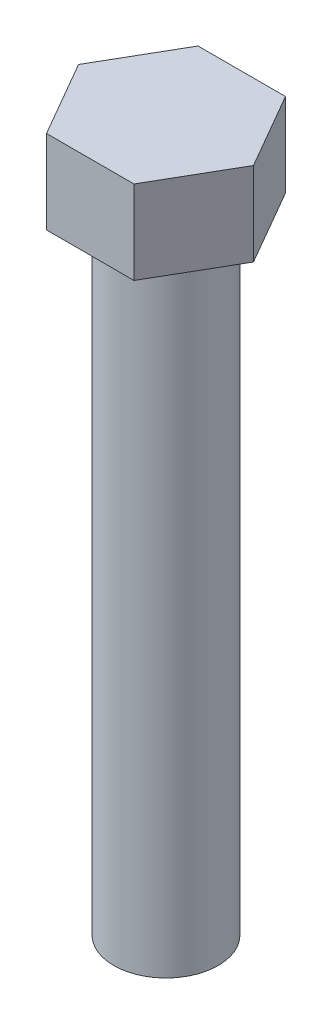
ISO-10303-21;
HEADER;
FILE_DESCRIPTION(('STEP AP214'),'2;1');
FILE_NAME('part.step','',(''),(''),'','','');
FILE_SCHEMA(('AUTOMOTIVE_DESIGN { 1 0 10303 214 1 1 1 1 }'));
ENDSEC;
DATA;
#1=APPLICATION_CONTEXT('core data for automotive mechanical design processes');
#2=APPLICATION_PROTOCOL_DEFINITION('international standard','automotive_design',2000,#1);
#3=PRODUCT_CONTEXT('',#1,'mechanical');
#4=PRODUCT('Part','Part','',(#3));
#5=PRODUCT_RELATED_PRODUCT_CATEGORY('part','',(#4));
#6=PRODUCT_DEFINITION_FORMATION('','',#4);
#7=PRODUCT_DEFINITION_CONTEXT('part definition',#1,'design');
#8=PRODUCT_DEFINITION('design','',#6,#7);
#9=PRODUCT_DEFINITION_SHAPE('','',#8);
#10=(LENGTH_UNIT() NAMED_UNIT(*) SI_UNIT(.MILLI.,.METRE.));
#11=(NAMED_UNIT(*) PLANE_ANGLE_UNIT() SI_UNIT($,.RADIAN.));
#12=(NAMED_UNIT(*) SI_UNIT($,.STERADIAN.) SOLID_ANGLE_UNIT());
#13=UNCERTAINTY_MEASURE_WITH_UNIT(LENGTH_MEASURE(1.E-05),#10,'distance_accuracy_value','');
#14=(GEOMETRIC_REPRESENTATION_CONTEXT(3) GLOBAL_UNCERTAINTY_ASSIGNED_CONTEXT((#13)) GLOBAL_UNIT_ASSIGNED_CONTEXT((#10,
#11,#12)) REPRESENTATION_CONTEXT('',''));
#15=CARTESIAN_POINT('',(0.,0.,0.));
#16=DIRECTION('',(0.,0.,1.));
#17=DIRECTION('',(1.,0.,0.));
#18=AXIS2_PLACEMENT_3D('',#15,#16,#17);
#19=CARTESIAN_POINT('',(0.,-600.,0.));
#20=DIRECTION('',(0.,1.,0.));
#21=DIRECTION('',(0.,0.,1.));
#22=AXIS2_PLACEMENT_3D('',#19,#20,#21);
#23=CYLINDRICAL_SURFACE('',#22,50.);
#24=CARTESIAN_POINT('',(0.,-600.,0.));
#25=DIRECTION('',(0.,1.,0.));
#26=DIRECTION('',(0.,0.,1.));
#27=AXIS2_PLACEMENT_3D('',#24,#25,#26);
#28=CIRCLE('',#27,50.);
#29=CARTESIAN_POINT('',(0.,-600.,50.));
#30=VERTEX_POINT('',#29);
#31=EDGE_CURVE('E11',#30,#30,#28,.T.);
#32=ORIENTED_EDGE('',*,*,#31,.T.);
#33=EDGE_LOOP('',(#32));
#34=FACE_BOUND('',#33,.T.);
#35=CARTESIAN_POINT('',(0.,0.,0.));
#36=DIRECTION('',(0.,1.,0.));
#37=DIRECTION('',(0.,0.,1.));
#38=AXIS2_PLACEMENT_3D('',#35,#36,#37);
#39=CIRCLE('',#38,50.);
#40=CARTESIAN_POINT('',(0.,0.,50.));
#41=VERTEX_POINT('',#40);
#42=EDGE_CURVE('E48',#41,#41,#39,.T.);
#43=ORIENTED_EDGE('',*,*,#42,.F.);
#44=EDGE_LOOP('',(#43));
#45=FACE_BOUND('',#44,.T.);
#46=ADVANCED_FACE('F45',(#34,#45),#23,.T.);
#47=CARTESIAN_POINT('',(0.,-600.,0.));
#48=DIRECTION('',(0.,1.,0.));
#49=DIRECTION('',(0.,0.,1.));
#50=AXIS2_PLACEMENT_3D('',#47,#48,#49);
#51=PLANE('',#50);
#52=ORIENTED_EDGE('',*,*,#31,.F.);
#53=EDGE_LOOP('',(#52));
#54=FACE_BOUND('',#53,.T.);
#55=ADVANCED_FACE('F173',(#54),#51,.F.);
#56=CARTESIAN_POINT('',(-41.8578945162478,80.,72.5));
#57=DIRECTION('',(0.,0.,-1.));
#58=DIRECTION('',(-1.,0.,0.));
#59=AXIS2_PLACEMENT_3D('',#56,#57,#58);
#60=PLANE('',#59);
#61=DIRECTION('',(1.,0.,0.));
#62=VECTOR('',#61,1.);
#63=CARTESIAN_POINT('',(-41.8578945162478,0.,72.5));
#64=LINE('',#63,#62);
#65=CARTESIAN_POINT('',(-41.8578945162478,0.,72.5));
#66=VERTEX_POINT('',#65);
#67=CARTESIAN_POINT('',(41.8578945162479,0.,72.5));
#68=VERTEX_POINT('',#67);
#69=EDGE_CURVE('E135',#66,#68,#64,.T.);
#70=ORIENTED_EDGE('',*,*,#69,.T.);
#71=DIRECTION('',(0.,-1.,0.));
#72=VECTOR('',#71,1.);
#73=CARTESIAN_POINT('',(41.8578945162479,80.,72.5));
#74=LINE('',#73,#72);
#75=CARTESIAN_POINT('',(41.8578945162479,80.,72.5));
#76=VERTEX_POINT('',#75);
#77=EDGE_CURVE('E162',#76,#68,#74,.T.);
#78=ORIENTED_EDGE('',*,*,#77,.F.);
#79=DIRECTION('',(1.,0.,0.));
#80=VECTOR('',#79,1.);
#81=CARTESIAN_POINT('',(-41.8578945162478,80.,72.5));
#82=LINE('',#81,#80);
#83=CARTESIAN_POINT('',(-41.8578945162478,80.,72.5));
#84=VERTEX_POINT('',#83);
#85=EDGE_CURVE('E151',#84,#76,#82,.T.);
#86=ORIENTED_EDGE('',*,*,#85,.F.);
#87=DIRECTION('',(0.,-1.,0.));
#88=VECTOR('',#87,1.);
#89=CARTESIAN_POINT('',(-41.8578945162478,80.,72.5));
#90=LINE('',#89,#88);
#91=EDGE_CURVE('E131',#84,#66,#90,.T.);
#92=ORIENTED_EDGE('',*,*,#91,.T.);
#93=EDGE_LOOP('',(#70,#78,#86,#92));
#94=FACE_BOUND('',#93,.T.);
#95=ADVANCED_FACE('F178',(#94),#60,.F.);
#96=CARTESIAN_POINT('',(41.8578945162479,80.,72.5));
#97=DIRECTION('',(-0.866025403784439,0.,-0.5));
#98=DIRECTION('',(-0.5,0.,0.866025403784439));
#99=AXIS2_PLACEMENT_3D('',#96,#97,#98);
#100=PLANE('',#99);
#101=DIRECTION('',(0.5,0.,-0.866025403784439));
#102=VECTOR('',#101,1.);
#103=CARTESIAN_POINT('',(41.8578945162479,0.,72.5));
#104=LINE('',#103,#102);
#105=CARTESIAN_POINT('',(83.7157890324957,0.,0.));
#106=VERTEX_POINT('',#105);
#107=EDGE_CURVE('E139',#68,#106,#104,.T.);
#108=ORIENTED_EDGE('',*,*,#107,.T.);
#109=DIRECTION('',(0.,-1.,0.));
#110=VECTOR('',#109,1.);
#111=CARTESIAN_POINT('',(83.7157890324957,80.,0.));
#112=LINE('',#111,#110);
#113=CARTESIAN_POINT('',(83.7157890324957,80.,0.));
#114=VERTEX_POINT('',#113);
#115=EDGE_CURVE('E158',#114,#106,#112,.T.);
#116=ORIENTED_EDGE('',*,*,#115,.F.);
#117=DIRECTION('',(0.5,0.,-0.866025403784439));
#118=VECTOR('',#117,1.);
#119=CARTESIAN_POINT('',(41.8578945162479,80.,72.5));
#120=LINE('',#119,#118);
#121=EDGE_CURVE('E100',#76,#114,#120,.T.);
#122=ORIENTED_EDGE('',*,*,#121,.F.);
#123=ORIENTED_EDGE('',*,*,#77,.T.);
#124=EDGE_LOOP('',(#108,#116,#122,#123));
#125=FACE_BOUND('',#124,.T.);
#126=ADVANCED_FACE('F184',(#125),#100,.F.);
#127=CARTESIAN_POINT('',(83.7157890324957,80.,0.));
#128=DIRECTION('',(-0.866025403784438,0.,0.5));
#129=DIRECTION('',(0.5,0.,0.866025403784439));
#130=AXIS2_PLACEMENT_3D('',#127,#128,#129);
#131=PLANE('',#130);
#132=DIRECTION('',(-0.5,0.,-0.866025403784438));
#133=VECTOR('',#132,1.);
#134=CARTESIAN_POINT('',(83.7157890324957,0.,0.));
#135=LINE('',#134,#133);
#136=CARTESIAN_POINT('',(41.8578945162479,0.,-72.5));
#137=VERTEX_POINT('',#136);
#138=EDGE_CURVE('E142',#106,#137,#135,.T.);
#139=ORIENTED_EDGE('',*,*,#138,.T.);
#140=DIRECTION('',(0.,-1.,0.));
#141=VECTOR('',#140,1.);
#142=CARTESIAN_POINT('',(41.8578945162479,80.,-72.5));
#143=LINE('',#142,#141);
#144=CARTESIAN_POINT('',(41.8578945162479,80.,-72.5));
#145=VERTEX_POINT('',#144);
#146=EDGE_CURVE('E124',#145,#137,#143,.T.);
#147=ORIENTED_EDGE('',*,*,#146,.F.);
#148=DIRECTION('',(-0.5,0.,-0.866025403784438));
#149=VECTOR('',#148,1.);
#150=CARTESIAN_POINT('',(83.7157890324957,80.,0.));
#151=LINE('',#150,#149);
#152=EDGE_CURVE('E113',#114,#145,#151,.T.);
#153=ORIENTED_EDGE('',*,*,#152,.F.);
#154=ORIENTED_EDGE('',*,*,#115,.T.);
#155=EDGE_LOOP('',(#139,#147,#153,#154));
#156=FACE_BOUND('',#155,.T.);
#157=ADVANCED_FACE('F190',(#156),#131,.F.);
#158=CARTESIAN_POINT('',(41.8578945162479,80.,-72.5));
#159=DIRECTION('',(0.,0.,1.));
#160=DIRECTION('',(1.,0.,0.));
#161=AXIS2_PLACEMENT_3D('',#158,#159,#160);
#162=PLANE('',#161);
#163=DIRECTION('',(-1.,0.,0.));
#164=VECTOR('',#163,1.);
#165=CARTESIAN_POINT('',(41.8578945162479,0.,-72.5));
#166=LINE('',#165,#164);
#167=CARTESIAN_POINT('',(-41.8578945162478,0.,-72.5));
#168=VERTEX_POINT('',#167);
#169=EDGE_CURVE('E122',#137,#168,#166,.T.);
#170=ORIENTED_EDGE('',*,*,#169,.T.);
#171=DIRECTION('',(0.,-1.,0.));
#172=VECTOR('',#171,1.);
#173=CARTESIAN_POINT('',(-41.8578945162478,80.,-72.5));
#174=LINE('',#173,#172);
#175=CARTESIAN_POINT('',(-41.8578945162478,80.,-72.5));
#176=VERTEX_POINT('',#175);
#177=EDGE_CURVE('E119',#176,#168,#174,.T.);
#178=ORIENTED_EDGE('',*,*,#177,.F.);
#179=DIRECTION('',(-1.,0.,0.));
#180=VECTOR('',#179,1.);
#181=CARTESIAN_POINT('',(41.8578945162479,80.,-72.5));
#182=LINE('',#181,#180);
#183=EDGE_CURVE('E107',#145,#176,#182,.T.);
#184=ORIENTED_EDGE('',*,*,#183,.F.);
#185=ORIENTED_EDGE('',*,*,#146,.T.);
#186=EDGE_LOOP('',(#170,#178,#184,#185));
#187=FACE_BOUND('',#186,.T.);
#188=ADVANCED_FACE('F120',(#187),#162,.F.);
#189=CARTESIAN_POINT('',(-41.8578945162478,80.,-72.5));
#190=DIRECTION('',(0.866025403784439,0.,0.5));
#191=DIRECTION('',(0.5,0.,-0.866025403784439));
#192=AXIS2_PLACEMENT_3D('',#189,#190,#191);
#193=PLANE('',#192);
#194=DIRECTION('',(-0.5,0.,0.866025403784439));
#195=VECTOR('',#194,1.);
#196=CARTESIAN_POINT('',(-41.8578945162478,0.,-72.5));
#197=LINE('',#196,#195);
#198=CARTESIAN_POINT('',(-83.7157890324957,0.,0.));
#199=VERTEX_POINT('',#198);
#200=EDGE_CURVE('E85',#168,#199,#197,.T.);
#201=ORIENTED_EDGE('',*,*,#200,.T.);
#202=DIRECTION('',(0.,-1.,0.));
#203=VECTOR('',#202,1.);
#204=CARTESIAN_POINT('',(-83.7157890324957,80.,0.));
#205=LINE('',#204,#203);
#206=CARTESIAN_POINT('',(-83.7157890324957,80.,0.));
#207=VERTEX_POINT('',#206);
#208=EDGE_CURVE('E125',#207,#199,#205,.T.);
#209=ORIENTED_EDGE('',*,*,#208,.F.);
#210=DIRECTION('',(-0.5,0.,0.866025403784439));
#211=VECTOR('',#210,1.);
#212=CARTESIAN_POINT('',(-41.8578945162478,80.,-72.5));
#213=LINE('',#212,#211);
#214=EDGE_CURVE('E111',#176,#207,#213,.T.);
#215=ORIENTED_EDGE('',*,*,#214,.F.);
#216=ORIENTED_EDGE('',*,*,#177,.T.);
#217=EDGE_LOOP('',(#201,#209,#215,#216));
#218=FACE_BOUND('',#217,.T.);
#219=ADVANCED_FACE('F127',(#218),#193,.F.);
#220=CARTESIAN_POINT('',(-83.7157890324957,80.,0.));
#221=DIRECTION('',(0.866025403784439,0.,-0.5));
#222=DIRECTION('',(-0.5,0.,-0.866025403784439));
#223=AXIS2_PLACEMENT_3D('',#220,#221,#222);
#224=PLANE('',#223);
#225=DIRECTION('',(0.5,0.,0.866025403784439));
#226=VECTOR('',#225,1.);
#227=CARTESIAN_POINT('',(-83.7157890324957,0.,0.));
#228=LINE('',#227,#226);
#229=EDGE_CURVE('E91',#199,#66,#228,.T.);
#230=ORIENTED_EDGE('',*,*,#229,.T.);
#231=ORIENTED_EDGE('',*,*,#91,.F.);
#232=DIRECTION('',(0.5,0.,0.866025403784439));
#233=VECTOR('',#232,1.);
#234=CARTESIAN_POINT('',(-83.7157890324957,80.,0.));
#235=LINE('',#234,#233);
#236=EDGE_CURVE('E62',#207,#84,#235,.T.);
#237=ORIENTED_EDGE('',*,*,#236,.F.);
#238=ORIENTED_EDGE('',*,*,#208,.T.);
#239=EDGE_LOOP('',(#230,#231,#237,#238));
#240=FACE_BOUND('',#239,.T.);
#241=ADVANCED_FACE('F198',(#240),#224,.F.);
#242=CARTESIAN_POINT('',(0.,80.,0.));
#243=DIRECTION('',(0.,1.,0.));
#244=DIRECTION('',(0.,0.,1.));
#245=AXIS2_PLACEMENT_3D('',#242,#243,#244);
#246=PLANE('',#245);
#247=ORIENTED_EDGE('',*,*,#85,.T.);
#248=ORIENTED_EDGE('',*,*,#121,.T.);
#249=ORIENTED_EDGE('',*,*,#152,.T.);
#250=ORIENTED_EDGE('',*,*,#183,.T.);
#251=ORIENTED_EDGE('',*,*,#214,.T.);
#252=ORIENTED_EDGE('',*,*,#236,.T.);
#253=EDGE_LOOP('',(#247,#248,#249,#250,#251,#252));
#254=FACE_BOUND('',#253,.T.);
#255=ADVANCED_FACE('F109',(#254),#246,.T.);
#256=CARTESIAN_POINT('',(0.,0.,0.));
#257=DIRECTION('',(0.,1.,0.));
#258=DIRECTION('',(0.,0.,1.));
#259=AXIS2_PLACEMENT_3D('',#256,#257,#258);
#260=PLANE('',#259);
#261=ORIENTED_EDGE('',*,*,#42,.T.);
#262=EDGE_LOOP('',(#261));
#263=FACE_BOUND('',#262,.T.);
#264=ORIENTED_EDGE('',*,*,#69,.F.);
#265=ORIENTED_EDGE('',*,*,#229,.F.);
#266=ORIENTED_EDGE('',*,*,#200,.F.);
#267=ORIENTED_EDGE('',*,*,#169,.F.);
#268=ORIENTED_EDGE('',*,*,#138,.F.);
#269=ORIENTED_EDGE('',*,*,#107,.F.);
#270=EDGE_LOOP('',(#264,#265,#266,#267,#268,#269));
#271=FACE_BOUND('',#270,.T.);
#272=ADVANCED_FACE('F169',(#263,#271),#260,.F.);
#273=CLOSED_SHELL('',(#46,#55,#95,#126,#157,#188,#219,#241,#255,#272));
#274=MANIFOLD_SOLID_BREP('B2',#273);
#275=ADVANCED_BREP_SHAPE_REPRESENTATION('',(#18,#274),#14);
#276=SHAPE_DEFINITION_REPRESENTATION(#9,#275);
ENDSEC;
END-ISO-10303-21;
